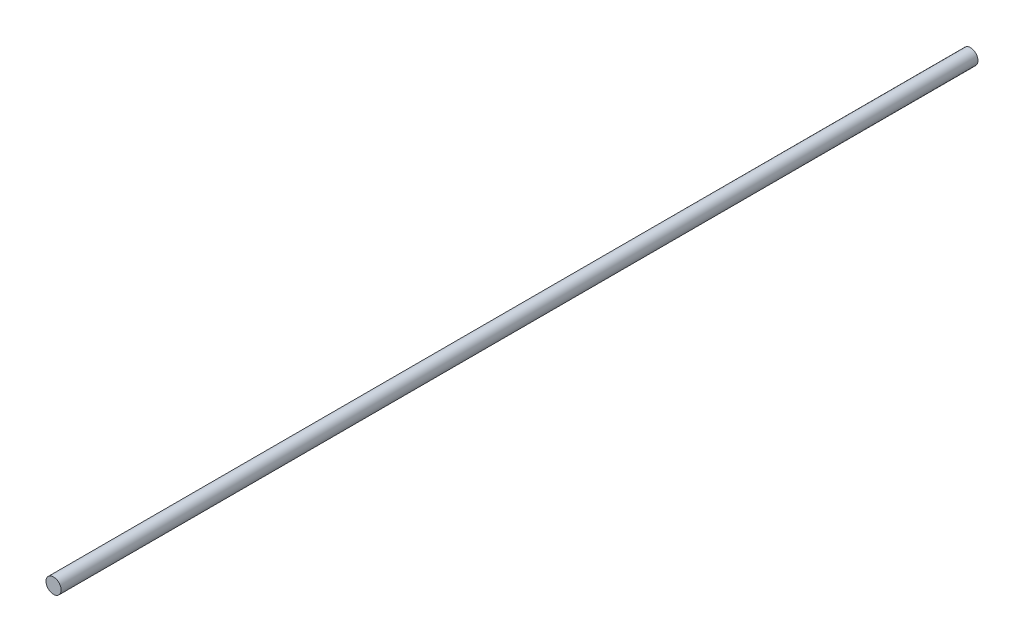
ISO-10303-21;
HEADER;
FILE_DESCRIPTION(('STEP AP214'),'2;1');
FILE_NAME('part.step','',(''),(''),'','','');
FILE_SCHEMA(('AUTOMOTIVE_DESIGN { 1 0 10303 214 1 1 1 1 }'));
ENDSEC;
DATA;
#1=APPLICATION_CONTEXT('core data for automotive mechanical design processes');
#2=APPLICATION_PROTOCOL_DEFINITION('international standard','automotive_design',2000,#1);
#3=PRODUCT_CONTEXT('',#1,'mechanical');
#4=PRODUCT('Part','Part','',(#3));
#5=PRODUCT_RELATED_PRODUCT_CATEGORY('part','',(#4));
#6=PRODUCT_DEFINITION_FORMATION('','',#4);
#7=PRODUCT_DEFINITION_CONTEXT('part definition',#1,'design');
#8=PRODUCT_DEFINITION('design','',#6,#7);
#9=PRODUCT_DEFINITION_SHAPE('','',#8);
#10=(LENGTH_UNIT() NAMED_UNIT(*) SI_UNIT(.MILLI.,.METRE.));
#11=(NAMED_UNIT(*) PLANE_ANGLE_UNIT() SI_UNIT($,.RADIAN.));
#12=(NAMED_UNIT(*) SI_UNIT($,.STERADIAN.) SOLID_ANGLE_UNIT());
#13=UNCERTAINTY_MEASURE_WITH_UNIT(LENGTH_MEASURE(1.E-05),#10,'distance_accuracy_value','');
#14=(GEOMETRIC_REPRESENTATION_CONTEXT(3) GLOBAL_UNCERTAINTY_ASSIGNED_CONTEXT((#13)) GLOBAL_UNIT_ASSIGNED_CONTEXT((#10,
#11,#12)) REPRESENTATION_CONTEXT('',''));
#15=CARTESIAN_POINT('',(0.,0.,0.));
#16=DIRECTION('',(0.,0.,1.));
#17=DIRECTION('',(1.,0.,0.));
#18=AXIS2_PLACEMENT_3D('',#15,#16,#17);
#19=CARTESIAN_POINT('',(0.,0.,485.));
#20=DIRECTION('',(0.,0.,-1.));
#21=DIRECTION('',(-1.,0.,0.));
#22=AXIS2_PLACEMENT_3D('',#19,#20,#21);
#23=CYLINDRICAL_SURFACE('',#22,4.);
#24=CARTESIAN_POINT('',(0.,0.,485.));
#25=DIRECTION('',(0.,0.,1.));
#26=DIRECTION('',(1.,0.,0.));
#27=AXIS2_PLACEMENT_3D('',#24,#25,#26);
#28=CIRCLE('',#27,4.);
#29=CARTESIAN_POINT('',(4.,0.,485.));
#30=VERTEX_POINT('',#29);
#31=EDGE_CURVE('E10',#30,#30,#28,.T.);
#32=ORIENTED_EDGE('',*,*,#31,.F.);
#33=EDGE_LOOP('',(#32));
#34=FACE_BOUND('',#33,.T.);
#35=CARTESIAN_POINT('',(0.,0.,0.));
#36=DIRECTION('',(0.,0.,1.));
#37=DIRECTION('',(1.,0.,0.));
#38=AXIS2_PLACEMENT_3D('',#35,#36,#37);
#39=CIRCLE('',#38,4.);
#40=CARTESIAN_POINT('',(4.,0.,0.));
#41=VERTEX_POINT('',#40);
#42=EDGE_CURVE('E33',#41,#41,#39,.T.);
#43=ORIENTED_EDGE('',*,*,#42,.T.);
#44=EDGE_LOOP('',(#43));
#45=FACE_BOUND('',#44,.T.);
#46=ADVANCED_FACE('F30',(#34,#45),#23,.T.);
#47=CARTESIAN_POINT('',(0.,0.,485.));
#48=DIRECTION('',(0.,0.,1.));
#49=DIRECTION('',(1.,0.,0.));
#50=AXIS2_PLACEMENT_3D('',#47,#48,#49);
#51=PLANE('',#50);
#52=ORIENTED_EDGE('',*,*,#31,.T.);
#53=EDGE_LOOP('',(#52));
#54=FACE_BOUND('',#53,.T.);
#55=ADVANCED_FACE('F45',(#54),#51,.T.);
#56=CARTESIAN_POINT('',(0.,0.,0.));
#57=DIRECTION('',(0.,0.,1.));
#58=DIRECTION('',(1.,0.,0.));
#59=AXIS2_PLACEMENT_3D('',#56,#57,#58);
#60=PLANE('',#59);
#61=ORIENTED_EDGE('',*,*,#42,.F.);
#62=EDGE_LOOP('',(#61));
#63=FACE_BOUND('',#62,.T.);
#64=ADVANCED_FACE('F43',(#63),#60,.F.);
#65=CLOSED_SHELL('',(#46,#55,#64));
#66=MANIFOLD_SOLID_BREP('B2',#65);
#67=ADVANCED_BREP_SHAPE_REPRESENTATION('',(#18,#66),#14);
#68=SHAPE_DEFINITION_REPRESENTATION(#9,#67);
ENDSEC;
END-ISO-10303-21;
